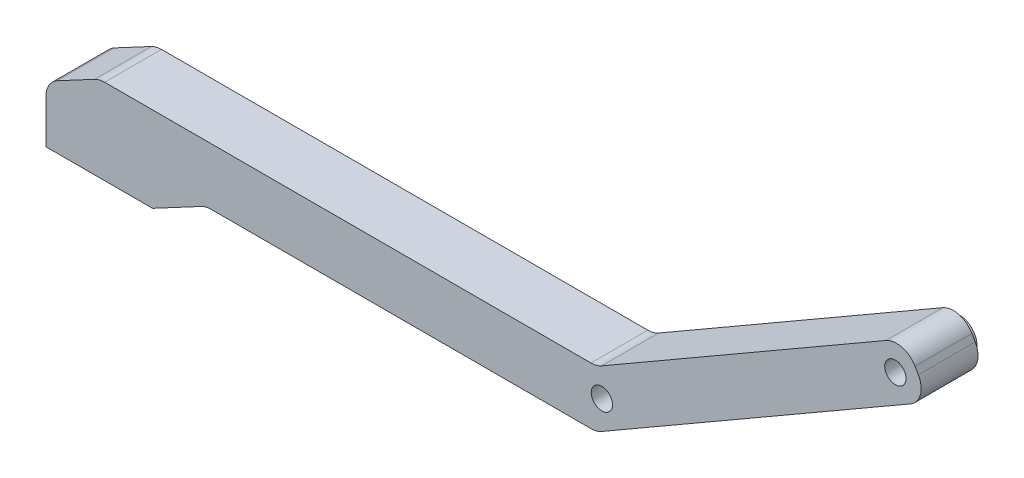
ISO-10303-21;
HEADER;
FILE_DESCRIPTION(('STEP AP214'),'2;1');
FILE_NAME('part.step','',(''),(''),'','','');
FILE_SCHEMA(('AUTOMOTIVE_DESIGN { 1 0 10303 214 1 1 1 1 }'));
ENDSEC;
DATA;
#1=APPLICATION_CONTEXT('core data for automotive mechanical design processes');
#2=APPLICATION_PROTOCOL_DEFINITION('international standard','automotive_design',2000,#1);
#3=PRODUCT_CONTEXT('',#1,'mechanical');
#4=PRODUCT('Part','Part','',(#3));
#5=PRODUCT_RELATED_PRODUCT_CATEGORY('part','',(#4));
#6=PRODUCT_DEFINITION_FORMATION('','',#4);
#7=PRODUCT_DEFINITION_CONTEXT('part definition',#1,'design');
#8=PRODUCT_DEFINITION('design','',#6,#7);
#9=PRODUCT_DEFINITION_SHAPE('','',#8);
#10=(LENGTH_UNIT() NAMED_UNIT(*) SI_UNIT(.MILLI.,.METRE.));
#11=(NAMED_UNIT(*) PLANE_ANGLE_UNIT() SI_UNIT($,.RADIAN.));
#12=(NAMED_UNIT(*) SI_UNIT($,.STERADIAN.) SOLID_ANGLE_UNIT());
#13=UNCERTAINTY_MEASURE_WITH_UNIT(LENGTH_MEASURE(1.E-05),#10,'distance_accuracy_value','');
#14=(GEOMETRIC_REPRESENTATION_CONTEXT(3) GLOBAL_UNCERTAINTY_ASSIGNED_CONTEXT((#13)) GLOBAL_UNIT_ASSIGNED_CONTEXT((#10,
#11,#12)) REPRESENTATION_CONTEXT('',''));
#15=CARTESIAN_POINT('',(0.,0.,0.));
#16=DIRECTION('',(0.,0.,1.));
#17=DIRECTION('',(1.,0.,0.));
#18=AXIS2_PLACEMENT_3D('',#15,#16,#17);
#19=CARTESIAN_POINT('',(0.,0.,8.));
#20=DIRECTION('',(0.,0.,1.));
#21=DIRECTION('',(1.,0.,0.));
#22=AXIS2_PLACEMENT_3D('',#19,#20,#21);
#23=PLANE('',#22);
#24=DIRECTION('',(-0.500000000000005,0.866025403784436,0.));
#25=VECTOR('',#24,1.);
#26=CARTESIAN_POINT('',(116.76537180436,27.,8.));
#27=LINE('',#26,#25);
#28=CARTESIAN_POINT('',(115.26537180436,29.5980762113533,8.));
#29=VERTEX_POINT('',#28);
#30=CARTESIAN_POINT('',(114.801270189222,30.4019237886467,8.));
#31=VERTEX_POINT('',#30);
#32=EDGE_CURVE('E335',#29,#31,#27,.T.);
#33=ORIENTED_EDGE('',*,*,#32,.T.);
#34=CARTESIAN_POINT('',(112.203193977869,28.9019237886467,8.));
#35=DIRECTION('',(0.,0.,1.));
#36=DIRECTION('',(1.,0.,0.));
#37=AXIS2_PLACEMENT_3D('',#34,#35,#36);
#38=CIRCLE('',#37,3.);
#39=CARTESIAN_POINT('',(110.703193977869,31.5,8.));
#40=VERTEX_POINT('',#39);
#41=EDGE_CURVE('E275',#31,#40,#38,.T.);
#42=ORIENTED_EDGE('',*,*,#41,.T.);
#43=DIRECTION('',(-0.866025403784439,-0.5,0.));
#44=VECTOR('',#43,1.);
#45=CARTESIAN_POINT('',(70.,8.,8.));
#46=LINE('',#45,#44);
#47=CARTESIAN_POINT('',(70.6961524227066,8.40192378864668,8.));
#48=VERTEX_POINT('',#47);
#49=EDGE_CURVE('E327',#40,#48,#46,.T.);
#50=ORIENTED_EDGE('',*,*,#49,.T.);
#51=CARTESIAN_POINT('',(69.1961524227066,11.,8.));
#52=DIRECTION('',(0.,0.,1.));
#53=DIRECTION('',(1.,0.,0.));
#54=AXIS2_PLACEMENT_3D('',#51,#52,#53);
#55=CIRCLE('',#54,3.);
#56=CARTESIAN_POINT('',(69.1961524227066,8.,8.));
#57=VERTEX_POINT('',#56);
#58=EDGE_CURVE('E11',#48,#57,#55,.F.);
#59=ORIENTED_EDGE('',*,*,#58,.T.);
#60=DIRECTION('',(-1.,0.,0.));
#61=VECTOR('',#60,1.);
#62=CARTESIAN_POINT('',(0.,8.,8.));
#63=LINE('',#62,#61);
#64=CARTESIAN_POINT('',(0.749999999999998,8.,8.));
#65=VERTEX_POINT('',#64);
#66=EDGE_CURVE('E325',#57,#65,#63,.T.);
#67=ORIENTED_EDGE('',*,*,#66,.T.);
#68=CARTESIAN_POINT('',(0.749999999999998,5.,8.));
#69=DIRECTION('',(0.,0.,1.));
#70=DIRECTION('',(1.,0.,0.));
#71=AXIS2_PLACEMENT_3D('',#68,#69,#70);
#72=CIRCLE('',#71,3.);
#73=CARTESIAN_POINT('',(-0.661764705882354,7.64705882352941,8.));
#74=VERTEX_POINT('',#73);
#75=EDGE_CURVE('E266',#65,#74,#72,.T.);
#76=ORIENTED_EDGE('',*,*,#75,.T.);
#77=DIRECTION('',(-0.882352941176471,-0.470588235294118,0.));
#78=VECTOR('',#77,1.);
#79=CARTESIAN_POINT('',(0.,8.,8.));
#80=LINE('',#79,#78);
#81=CARTESIAN_POINT('',(-5.91176470588236,4.84705882352941,8.));
#82=VERTEX_POINT('',#81);
#83=EDGE_CURVE('E170',#74,#82,#80,.T.);
#84=ORIENTED_EDGE('',*,*,#83,.T.);
#85=CARTESIAN_POINT('',(-4.5,2.2,8.));
#86=DIRECTION('',(0.,0.,1.));
#87=DIRECTION('',(1.,0.,0.));
#88=AXIS2_PLACEMENT_3D('',#85,#86,#87);
#89=CIRCLE('',#88,3.);
#90=CARTESIAN_POINT('',(-7.5,2.2,8.));
#91=VERTEX_POINT('',#90);
#92=EDGE_CURVE('E62',#82,#91,#89,.T.);
#93=ORIENTED_EDGE('',*,*,#92,.T.);
#94=DIRECTION('',(0.,-1.,0.));
#95=VECTOR('',#94,1.);
#96=CARTESIAN_POINT('',(-7.5,4.,8.));
#97=LINE('',#96,#95);
#98=CARTESIAN_POINT('',(-7.5,-4.,8.));
#99=VERTEX_POINT('',#98);
#100=EDGE_CURVE('E158',#91,#99,#97,.T.);
#101=ORIENTED_EDGE('',*,*,#100,.T.);
#102=DIRECTION('',(1.,0.,0.));
#103=VECTOR('',#102,1.);
#104=CARTESIAN_POINT('',(-7.5,-4.,8.));
#105=LINE('',#104,#103);
#106=CARTESIAN_POINT('',(7.5,-4.,8.));
#107=VERTEX_POINT('',#106);
#108=EDGE_CURVE('E164',#99,#107,#105,.T.);
#109=ORIENTED_EDGE('',*,*,#108,.T.);
#110=DIRECTION('',(0.882352941176471,0.470588235294118,0.));
#111=VECTOR('',#110,1.);
#112=CARTESIAN_POINT('',(7.5,-4.,8.));
#113=LINE('',#112,#111);
#114=CARTESIAN_POINT('',(14.3382352941176,-0.352941176470585,8.));
#115=VERTEX_POINT('',#114);
#116=EDGE_CURVE('E224',#107,#115,#113,.T.);
#117=ORIENTED_EDGE('',*,*,#116,.T.);
#118=CARTESIAN_POINT('',(15.75,-3.,8.));
#119=DIRECTION('',(0.,0.,1.));
#120=DIRECTION('',(1.,0.,0.));
#121=AXIS2_PLACEMENT_3D('',#118,#119,#120);
#122=CIRCLE('',#121,3.);
#123=CARTESIAN_POINT('',(15.75,0.,8.));
#124=VERTEX_POINT('',#123);
#125=EDGE_CURVE('E304',#115,#124,#122,.F.);
#126=ORIENTED_EDGE('',*,*,#125,.T.);
#127=DIRECTION('',(1.,0.,0.));
#128=VECTOR('',#127,1.);
#129=CARTESIAN_POINT('',(15.,0.,8.));
#130=LINE('',#129,#128);
#131=CARTESIAN_POINT('',(69.1961524227066,0.,8.));
#132=VERTEX_POINT('',#131);
#133=EDGE_CURVE('E344',#124,#132,#130,.T.);
#134=ORIENTED_EDGE('',*,*,#133,.T.);
#135=CARTESIAN_POINT('',(69.1961524227066,3.,8.));
#136=DIRECTION('',(0.,0.,1.));
#137=DIRECTION('',(1.,0.,0.));
#138=AXIS2_PLACEMENT_3D('',#135,#136,#137);
#139=CIRCLE('',#138,3.);
#140=CARTESIAN_POINT('',(70.6961524227066,0.40192378864668,8.));
#141=VERTEX_POINT('',#140);
#142=EDGE_CURVE('E269',#132,#141,#139,.T.);
#143=ORIENTED_EDGE('',*,*,#142,.T.);
#144=DIRECTION('',(0.866025403784439,0.5,0.));
#145=VECTOR('',#144,1.);
#146=CARTESIAN_POINT('',(70.,0.,8.));
#147=LINE('',#146,#145);
#148=CARTESIAN_POINT('',(114.167295593006,25.5,8.));
#149=VERTEX_POINT('',#148);
#150=EDGE_CURVE('E340',#141,#149,#147,.T.);
#151=ORIENTED_EDGE('',*,*,#150,.T.);
#152=CARTESIAN_POINT('',(112.667295593006,28.0980762113533,8.));
#153=DIRECTION('',(0.,0.,1.));
#154=DIRECTION('',(1.,0.,0.));
#155=AXIS2_PLACEMENT_3D('',#152,#153,#154);
#156=CIRCLE('',#155,3.);
#157=EDGE_CURVE('E272',#149,#29,#156,.T.);
#158=ORIENTED_EDGE('',*,*,#157,.T.);
#159=EDGE_LOOP('',(#33,#42,#50,#59,#67,#76,#84,#93,#101,#109,#117,#126,#134,#143,#151,#158));
#160=FACE_BOUND('',#159,.T.);
#161=CARTESIAN_POINT('',(70.727461339179,4.42000000000001,8.));
#162=DIRECTION('',(0.,0.,1.));
#163=DIRECTION('',(1.,0.,0.));
#164=AXIS2_PLACEMENT_3D('',#161,#162,#163);
#165=CIRCLE('',#164,1.5);
#166=CARTESIAN_POINT('',(72.227461339179,4.42000000000001,8.));
#167=VERTEX_POINT('',#166);
#168=EDGE_CURVE('E353',#167,#167,#165,.T.);
#169=ORIENTED_EDGE('',*,*,#168,.F.);
#170=EDGE_LOOP('',(#169));
#171=FACE_BOUND('',#170,.T.);
#172=CARTESIAN_POINT('',(112.036873099697,28.27,8.));
#173=DIRECTION('',(0.,0.,1.));
#174=DIRECTION('',(1.,0.,0.));
#175=AXIS2_PLACEMENT_3D('',#172,#173,#174);
#176=CIRCLE('',#175,1.5);
#177=CARTESIAN_POINT('',(113.536873099697,28.27,8.));
#178=VERTEX_POINT('',#177);
#179=EDGE_CURVE('E197',#178,#178,#176,.T.);
#180=ORIENTED_EDGE('',*,*,#179,.F.);
#181=EDGE_LOOP('',(#180));
#182=FACE_BOUND('',#181,.T.);
#183=ADVANCED_FACE('F45',(#160,#171,#182),#23,.T.);
#184=CARTESIAN_POINT('',(0.,0.,0.));
#185=DIRECTION('',(0.,0.,1.));
#186=DIRECTION('',(1.,0.,0.));
#187=AXIS2_PLACEMENT_3D('',#184,#185,#186);
#188=PLANE('',#187);
#189=CARTESIAN_POINT('',(112.036873099697,28.27,0.));
#190=DIRECTION('',(0.,0.,1.));
#191=DIRECTION('',(1.,0.,0.));
#192=AXIS2_PLACEMENT_3D('',#189,#190,#191);
#193=CIRCLE('',#192,2.5);
#194=CARTESIAN_POINT('',(114.536873099697,28.27,0.));
#195=VERTEX_POINT('',#194);
#196=EDGE_CURVE('E49',#195,#195,#193,.T.);
#197=ORIENTED_EDGE('',*,*,#196,.T.);
#198=EDGE_LOOP('',(#197));
#199=FACE_BOUND('',#198,.T.);
#200=DIRECTION('',(-0.866025403784439,-0.5,0.));
#201=VECTOR('',#200,1.);
#202=CARTESIAN_POINT('',(70.,8.,0.));
#203=LINE('',#202,#201);
#204=CARTESIAN_POINT('',(110.703193977869,31.5,0.));
#205=VERTEX_POINT('',#204);
#206=CARTESIAN_POINT('',(70.6961524227066,8.40192378864668,0.));
#207=VERTEX_POINT('',#206);
#208=EDGE_CURVE('E209',#205,#207,#203,.T.);
#209=ORIENTED_EDGE('',*,*,#208,.F.);
#210=CARTESIAN_POINT('',(112.203193977869,28.9019237886467,0.));
#211=DIRECTION('',(0.,0.,1.));
#212=DIRECTION('',(1.,0.,0.));
#213=AXIS2_PLACEMENT_3D('',#210,#211,#212);
#214=CIRCLE('',#213,3.);
#215=CARTESIAN_POINT('',(114.801270189222,30.4019237886467,0.));
#216=VERTEX_POINT('',#215);
#217=EDGE_CURVE('E254',#205,#216,#214,.F.);
#218=ORIENTED_EDGE('',*,*,#217,.T.);
#219=DIRECTION('',(-0.500000000000005,0.866025403784436,0.));
#220=VECTOR('',#219,1.);
#221=CARTESIAN_POINT('',(116.76537180436,27.,0.));
#222=LINE('',#221,#220);
#223=CARTESIAN_POINT('',(115.26537180436,29.5980762113533,0.));
#224=VERTEX_POINT('',#223);
#225=EDGE_CURVE('E205',#224,#216,#222,.T.);
#226=ORIENTED_EDGE('',*,*,#225,.F.);
#227=CARTESIAN_POINT('',(112.667295593006,28.0980762113533,0.));
#228=DIRECTION('',(0.,0.,1.));
#229=DIRECTION('',(1.,0.,0.));
#230=AXIS2_PLACEMENT_3D('',#227,#228,#229);
#231=CIRCLE('',#230,3.);
#232=CARTESIAN_POINT('',(114.167295593006,25.5,0.));
#233=VERTEX_POINT('',#232);
#234=EDGE_CURVE('E251',#224,#233,#231,.F.);
#235=ORIENTED_EDGE('',*,*,#234,.T.);
#236=DIRECTION('',(0.866025403784439,0.5,0.));
#237=VECTOR('',#236,1.);
#238=CARTESIAN_POINT('',(70.,0.,0.));
#239=LINE('',#238,#237);
#240=CARTESIAN_POINT('',(70.6961524227066,0.40192378864668,0.));
#241=VERTEX_POINT('',#240);
#242=EDGE_CURVE('E201',#241,#233,#239,.T.);
#243=ORIENTED_EDGE('',*,*,#242,.F.);
#244=CARTESIAN_POINT('',(69.1961524227066,3.,0.));
#245=DIRECTION('',(0.,0.,1.));
#246=DIRECTION('',(1.,0.,0.));
#247=AXIS2_PLACEMENT_3D('',#244,#245,#246);
#248=CIRCLE('',#247,3.);
#249=CARTESIAN_POINT('',(69.1961524227066,0.,0.));
#250=VERTEX_POINT('',#249);
#251=EDGE_CURVE('E248',#241,#250,#248,.F.);
#252=ORIENTED_EDGE('',*,*,#251,.T.);
#253=DIRECTION('',(1.,0.,0.));
#254=VECTOR('',#253,1.);
#255=CARTESIAN_POINT('',(15.,0.,0.));
#256=LINE('',#255,#254);
#257=CARTESIAN_POINT('',(15.75,0.,0.));
#258=VERTEX_POINT('',#257);
#259=EDGE_CURVE('E196',#258,#250,#256,.T.);
#260=ORIENTED_EDGE('',*,*,#259,.F.);
#261=CARTESIAN_POINT('',(15.75,-3.,0.));
#262=DIRECTION('',(0.,0.,1.));
#263=DIRECTION('',(1.,0.,0.));
#264=AXIS2_PLACEMENT_3D('',#261,#262,#263);
#265=CIRCLE('',#264,3.);
#266=CARTESIAN_POINT('',(14.3382352941176,-0.352941176470585,0.));
#267=VERTEX_POINT('',#266);
#268=EDGE_CURVE('E301',#258,#267,#265,.T.);
#269=ORIENTED_EDGE('',*,*,#268,.T.);
#270=DIRECTION('',(0.882352941176471,0.470588235294118,0.));
#271=VECTOR('',#270,1.);
#272=CARTESIAN_POINT('',(7.5,-4.,0.));
#273=LINE('',#272,#271);
#274=CARTESIAN_POINT('',(7.5,-4.,0.));
#275=VERTEX_POINT('',#274);
#276=EDGE_CURVE('E192',#275,#267,#273,.T.);
#277=ORIENTED_EDGE('',*,*,#276,.F.);
#278=DIRECTION('',(1.,0.,0.));
#279=VECTOR('',#278,1.);
#280=CARTESIAN_POINT('',(-7.5,-4.,0.));
#281=LINE('',#280,#279);
#282=CARTESIAN_POINT('',(-7.5,-4.,0.));
#283=VERTEX_POINT('',#282);
#284=EDGE_CURVE('E222',#283,#275,#281,.T.);
#285=ORIENTED_EDGE('',*,*,#284,.F.);
#286=DIRECTION('',(0.,-1.,0.));
#287=VECTOR('',#286,1.);
#288=CARTESIAN_POINT('',(-7.5,4.,0.));
#289=LINE('',#288,#287);
#290=CARTESIAN_POINT('',(-7.5,2.2,0.));
#291=VERTEX_POINT('',#290);
#292=EDGE_CURVE('E176',#291,#283,#289,.T.);
#293=ORIENTED_EDGE('',*,*,#292,.F.);
#294=CARTESIAN_POINT('',(-4.5,2.2,0.));
#295=DIRECTION('',(0.,0.,1.));
#296=DIRECTION('',(1.,0.,0.));
#297=AXIS2_PLACEMENT_3D('',#294,#295,#296);
#298=CIRCLE('',#297,3.);
#299=CARTESIAN_POINT('',(-5.91176470588236,4.84705882352941,0.));
#300=VERTEX_POINT('',#299);
#301=EDGE_CURVE('E242',#291,#300,#298,.F.);
#302=ORIENTED_EDGE('',*,*,#301,.T.);
#303=DIRECTION('',(-0.882352941176471,-0.470588235294118,0.));
#304=VECTOR('',#303,1.);
#305=CARTESIAN_POINT('',(0.,8.,0.));
#306=LINE('',#305,#304);
#307=CARTESIAN_POINT('',(-0.661764705882354,7.64705882352941,0.));
#308=VERTEX_POINT('',#307);
#309=EDGE_CURVE('E217',#308,#300,#306,.T.);
#310=ORIENTED_EDGE('',*,*,#309,.F.);
#311=CARTESIAN_POINT('',(0.749999999999998,5.,0.));
#312=DIRECTION('',(0.,0.,1.));
#313=DIRECTION('',(1.,0.,0.));
#314=AXIS2_PLACEMENT_3D('',#311,#312,#313);
#315=CIRCLE('',#314,3.);
#316=CARTESIAN_POINT('',(0.749999999999998,8.,0.));
#317=VERTEX_POINT('',#316);
#318=EDGE_CURVE('E245',#308,#317,#315,.F.);
#319=ORIENTED_EDGE('',*,*,#318,.T.);
#320=DIRECTION('',(-1.,0.,0.));
#321=VECTOR('',#320,1.);
#322=CARTESIAN_POINT('',(0.,8.,0.));
#323=LINE('',#322,#321);
#324=CARTESIAN_POINT('',(69.1961524227066,8.,0.));
#325=VERTEX_POINT('',#324);
#326=EDGE_CURVE('E213',#325,#317,#323,.T.);
#327=ORIENTED_EDGE('',*,*,#326,.F.);
#328=CARTESIAN_POINT('',(69.1961524227066,11.,0.));
#329=DIRECTION('',(0.,0.,1.));
#330=DIRECTION('',(1.,0.,0.));
#331=AXIS2_PLACEMENT_3D('',#328,#329,#330);
#332=CIRCLE('',#331,3.);
#333=EDGE_CURVE('E55',#325,#207,#332,.T.);
#334=ORIENTED_EDGE('',*,*,#333,.T.);
#335=EDGE_LOOP('',(#209,#218,#226,#235,#243,#252,#260,#269,#277,#285,#293,#302,#310,#319,#327,#334));
#336=FACE_BOUND('',#335,.T.);
#337=CARTESIAN_POINT('',(70.727461339179,4.42000000000001,0.));
#338=DIRECTION('',(0.,0.,1.));
#339=DIRECTION('',(1.,0.,0.));
#340=AXIS2_PLACEMENT_3D('',#337,#338,#339);
#341=CIRCLE('',#340,1.5);
#342=CARTESIAN_POINT('',(72.227461339179,4.42000000000001,0.));
#343=VERTEX_POINT('',#342);
#344=EDGE_CURVE('E354',#343,#343,#341,.T.);
#345=ORIENTED_EDGE('',*,*,#344,.T.);
#346=EDGE_LOOP('',(#345));
#347=FACE_BOUND('',#346,.T.);
#348=ADVANCED_FACE('F311',(#199,#336,#347),#188,.F.);
#349=CARTESIAN_POINT('',(7.5,-4.,8.));
#350=DIRECTION('',(-0.470588235294118,0.88235294117647,0.));
#351=DIRECTION('',(-0.882352941176471,-0.470588235294118,0.));
#352=AXIS2_PLACEMENT_3D('',#349,#350,#351);
#353=PLANE('',#352);
#354=ORIENTED_EDGE('',*,*,#276,.T.);
#355=DIRECTION('',(0.,0.,-1.));
#356=VECTOR('',#355,1.);
#357=CARTESIAN_POINT('',(14.3382352941176,-0.352941176470586,8.));
#358=LINE('',#357,#356);
#359=EDGE_CURVE('E232',#267,#115,#358,.F.);
#360=ORIENTED_EDGE('',*,*,#359,.T.);
#361=ORIENTED_EDGE('',*,*,#116,.F.);
#362=DIRECTION('',(0.,0.,-1.));
#363=VECTOR('',#362,1.);
#364=CARTESIAN_POINT('',(7.5,-4.,8.));
#365=LINE('',#364,#363);
#366=EDGE_CURVE('E181',#107,#275,#365,.T.);
#367=ORIENTED_EDGE('',*,*,#366,.T.);
#368=EDGE_LOOP('',(#354,#360,#361,#367));
#369=FACE_BOUND('',#368,.T.);
#370=ADVANCED_FACE('F393',(#369),#353,.F.);
#371=CARTESIAN_POINT('',(15.,0.,8.));
#372=DIRECTION('',(0.,1.,0.));
#373=DIRECTION('',(-1.,0.,0.));
#374=AXIS2_PLACEMENT_3D('',#371,#372,#373);
#375=PLANE('',#374);
#376=ORIENTED_EDGE('',*,*,#133,.F.);
#377=DIRECTION('',(0.,0.,-1.));
#378=VECTOR('',#377,1.);
#379=CARTESIAN_POINT('',(15.75,0.,0.));
#380=LINE('',#379,#378);
#381=EDGE_CURVE('E228',#124,#258,#380,.T.);
#382=ORIENTED_EDGE('',*,*,#381,.T.);
#383=ORIENTED_EDGE('',*,*,#259,.T.);
#384=DIRECTION('',(0.,0.,-1.));
#385=VECTOR('',#384,1.);
#386=CARTESIAN_POINT('',(69.1961524227066,0.,8.));
#387=LINE('',#386,#385);
#388=EDGE_CURVE('E180',#250,#132,#387,.F.);
#389=ORIENTED_EDGE('',*,*,#388,.T.);
#390=EDGE_LOOP('',(#376,#382,#383,#389));
#391=FACE_BOUND('',#390,.T.);
#392=ADVANCED_FACE('F413',(#391),#375,.F.);
#393=CARTESIAN_POINT('',(70.,0.,8.));
#394=DIRECTION('',(-0.5,0.866025403784439,0.));
#395=DIRECTION('',(-0.866025403784439,-0.5,0.));
#396=AXIS2_PLACEMENT_3D('',#393,#394,#395);
#397=PLANE('',#396);
#398=ORIENTED_EDGE('',*,*,#242,.T.);
#399=DIRECTION('',(0.,0.,-1.));
#400=VECTOR('',#399,1.);
#401=CARTESIAN_POINT('',(114.167295593006,25.5,8.));
#402=LINE('',#401,#400);
#403=EDGE_CURVE('E282',#233,#149,#402,.F.);
#404=ORIENTED_EDGE('',*,*,#403,.T.);
#405=ORIENTED_EDGE('',*,*,#150,.F.);
#406=DIRECTION('',(0.,0.,-1.));
#407=VECTOR('',#406,1.);
#408=CARTESIAN_POINT('',(70.6961524227066,0.401923788646679,8.));
#409=LINE('',#408,#407);
#410=EDGE_CURVE('E278',#141,#241,#409,.T.);
#411=ORIENTED_EDGE('',*,*,#410,.T.);
#412=EDGE_LOOP('',(#398,#404,#405,#411));
#413=FACE_BOUND('',#412,.T.);
#414=ADVANCED_FACE('F409',(#413),#397,.F.);
#415=CARTESIAN_POINT('',(116.76537180436,27.,8.));
#416=DIRECTION('',(-0.866025403784436,-0.500000000000004,0.));
#417=DIRECTION('',(0.500000000000005,-0.866025403784436,0.));
#418=AXIS2_PLACEMENT_3D('',#415,#416,#417);
#419=PLANE('',#418);
#420=ORIENTED_EDGE('',*,*,#225,.T.);
#421=DIRECTION('',(0.,0.,-1.));
#422=VECTOR('',#421,1.);
#423=CARTESIAN_POINT('',(114.801270189222,30.4019237886467,8.));
#424=LINE('',#423,#422);
#425=EDGE_CURVE('E261',#216,#31,#424,.F.);
#426=ORIENTED_EDGE('',*,*,#425,.T.);
#427=ORIENTED_EDGE('',*,*,#32,.F.);
#428=DIRECTION('',(0.,0.,-1.));
#429=VECTOR('',#428,1.);
#430=CARTESIAN_POINT('',(115.26537180436,29.5980762113533,8.));
#431=LINE('',#430,#429);
#432=EDGE_CURVE('E257',#29,#224,#431,.T.);
#433=ORIENTED_EDGE('',*,*,#432,.T.);
#434=EDGE_LOOP('',(#420,#426,#427,#433));
#435=FACE_BOUND('',#434,.T.);
#436=ADVANCED_FACE('F406',(#435),#419,.F.);
#437=CARTESIAN_POINT('',(70.,8.,8.));
#438=DIRECTION('',(0.5,-0.866025403784439,0.));
#439=DIRECTION('',(0.866025403784439,0.5,0.));
#440=AXIS2_PLACEMENT_3D('',#437,#438,#439);
#441=PLANE('',#440);
#442=ORIENTED_EDGE('',*,*,#49,.F.);
#443=DIRECTION('',(0.,0.,-1.));
#444=VECTOR('',#443,1.);
#445=CARTESIAN_POINT('',(110.703193977869,31.5,8.));
#446=LINE('',#445,#444);
#447=EDGE_CURVE('E238',#40,#205,#446,.T.);
#448=ORIENTED_EDGE('',*,*,#447,.T.);
#449=ORIENTED_EDGE('',*,*,#208,.T.);
#450=DIRECTION('',(0.,0.,-1.));
#451=VECTOR('',#450,1.);
#452=CARTESIAN_POINT('',(70.6961524227066,8.40192378864668,8.));
#453=LINE('',#452,#451);
#454=EDGE_CURVE('E235',#207,#48,#453,.F.);
#455=ORIENTED_EDGE('',*,*,#454,.T.);
#456=EDGE_LOOP('',(#442,#448,#449,#455));
#457=FACE_BOUND('',#456,.T.);
#458=ADVANCED_FACE('F318',(#457),#441,.F.);
#459=CARTESIAN_POINT('',(0.,8.,8.));
#460=DIRECTION('',(0.,-1.,0.));
#461=DIRECTION('',(0.,0.,-1.));
#462=AXIS2_PLACEMENT_3D('',#459,#460,#461);
#463=PLANE('',#462);
#464=ORIENTED_EDGE('',*,*,#66,.F.);
#465=DIRECTION('',(0.,0.,-1.));
#466=VECTOR('',#465,1.);
#467=CARTESIAN_POINT('',(69.1961524227066,8.,0.));
#468=LINE('',#467,#466);
#469=EDGE_CURVE('E288',#57,#325,#468,.T.);
#470=ORIENTED_EDGE('',*,*,#469,.T.);
#471=ORIENTED_EDGE('',*,*,#326,.T.);
#472=DIRECTION('',(0.,0.,-1.));
#473=VECTOR('',#472,1.);
#474=CARTESIAN_POINT('',(0.749999999999998,8.,8.));
#475=LINE('',#474,#473);
#476=EDGE_CURVE('E285',#317,#65,#475,.F.);
#477=ORIENTED_EDGE('',*,*,#476,.T.);
#478=EDGE_LOOP('',(#464,#470,#471,#477));
#479=FACE_BOUND('',#478,.T.);
#480=ADVANCED_FACE('F329',(#479),#463,.F.);
#481=CARTESIAN_POINT('',(0.,8.,8.));
#482=DIRECTION('',(0.470588235294118,-0.882352941176471,0.));
#483=DIRECTION('',(0.882352941176471,0.470588235294118,0.));
#484=AXIS2_PLACEMENT_3D('',#481,#482,#483);
#485=PLANE('',#484);
#486=ORIENTED_EDGE('',*,*,#83,.F.);
#487=DIRECTION('',(0.,0.,-1.));
#488=VECTOR('',#487,1.);
#489=CARTESIAN_POINT('',(-0.661764705882354,7.64705882352941,8.));
#490=LINE('',#489,#488);
#491=EDGE_CURVE('E294',#74,#308,#490,.T.);
#492=ORIENTED_EDGE('',*,*,#491,.T.);
#493=ORIENTED_EDGE('',*,*,#309,.T.);
#494=DIRECTION('',(0.,0.,-1.));
#495=VECTOR('',#494,1.);
#496=CARTESIAN_POINT('',(-5.91176470588236,4.84705882352941,8.));
#497=LINE('',#496,#495);
#498=EDGE_CURVE('E70',#300,#82,#497,.F.);
#499=ORIENTED_EDGE('',*,*,#498,.T.);
#500=EDGE_LOOP('',(#486,#492,#493,#499));
#501=FACE_BOUND('',#500,.T.);
#502=ADVANCED_FACE('F399',(#501),#485,.F.);
#503=CARTESIAN_POINT('',(-7.5,4.,8.));
#504=DIRECTION('',(1.,0.,0.));
#505=DIRECTION('',(0.,0.,-1.));
#506=AXIS2_PLACEMENT_3D('',#503,#504,#505);
#507=PLANE('',#506);
#508=ORIENTED_EDGE('',*,*,#100,.F.);
#509=DIRECTION('',(0.,0.,-1.));
#510=VECTOR('',#509,1.);
#511=CARTESIAN_POINT('',(-7.5,2.2,8.));
#512=LINE('',#511,#510);
#513=EDGE_CURVE('E298',#91,#291,#512,.T.);
#514=ORIENTED_EDGE('',*,*,#513,.T.);
#515=ORIENTED_EDGE('',*,*,#292,.T.);
#516=DIRECTION('',(0.,0.,-1.));
#517=VECTOR('',#516,1.);
#518=CARTESIAN_POINT('',(-7.5,-4.,8.));
#519=LINE('',#518,#517);
#520=EDGE_CURVE('E173',#99,#283,#519,.T.);
#521=ORIENTED_EDGE('',*,*,#520,.F.);
#522=EDGE_LOOP('',(#508,#514,#515,#521));
#523=FACE_BOUND('',#522,.T.);
#524=ADVANCED_FACE('F174',(#523),#507,.F.);
#525=CARTESIAN_POINT('',(-7.5,-4.,8.));
#526=DIRECTION('',(0.,1.,0.));
#527=DIRECTION('',(0.,0.,1.));
#528=AXIS2_PLACEMENT_3D('',#525,#526,#527);
#529=PLANE('',#528);
#530=ORIENTED_EDGE('',*,*,#284,.T.);
#531=ORIENTED_EDGE('',*,*,#366,.F.);
#532=ORIENTED_EDGE('',*,*,#108,.F.);
#533=ORIENTED_EDGE('',*,*,#520,.T.);
#534=EDGE_LOOP('',(#530,#531,#532,#533));
#535=FACE_BOUND('',#534,.T.);
#536=ADVANCED_FACE('F183',(#535),#529,.F.);
#537=CARTESIAN_POINT('',(112.036873099697,28.27,8.));
#538=DIRECTION('',(0.,0.,-1.));
#539=DIRECTION('',(-1.,0.,0.));
#540=AXIS2_PLACEMENT_3D('',#537,#538,#539);
#541=CYLINDRICAL_SURFACE('',#540,1.5);
#542=ORIENTED_EDGE('',*,*,#179,.T.);
#543=EDGE_LOOP('',(#542));
#544=FACE_BOUND('',#543,.T.);
#545=CARTESIAN_POINT('',(112.036873099697,28.27,-0.999999999999999));
#546=DIRECTION('',(0.,0.,1.));
#547=DIRECTION('',(1.,0.,0.));
#548=AXIS2_PLACEMENT_3D('',#545,#546,#547);
#549=CIRCLE('',#548,1.5);
#550=CARTESIAN_POINT('',(113.536873099697,28.27,-0.999999999999999));
#551=VERTEX_POINT('',#550);
#552=EDGE_CURVE('E365',#551,#551,#549,.T.);
#553=ORIENTED_EDGE('',*,*,#552,.F.);
#554=EDGE_LOOP('',(#553));
#555=FACE_BOUND('',#554,.T.);
#556=ADVANCED_FACE('F373',(#544,#555),#541,.F.);
#557=CARTESIAN_POINT('',(70.727461339179,4.42000000000001,8.));
#558=DIRECTION('',(0.,0.,-1.));
#559=DIRECTION('',(-1.,0.,0.));
#560=AXIS2_PLACEMENT_3D('',#557,#558,#559);
#561=CYLINDRICAL_SURFACE('',#560,1.5);
#562=ORIENTED_EDGE('',*,*,#168,.T.);
#563=EDGE_LOOP('',(#562));
#564=FACE_BOUND('',#563,.T.);
#565=ORIENTED_EDGE('',*,*,#344,.F.);
#566=EDGE_LOOP('',(#565));
#567=FACE_BOUND('',#566,.T.);
#568=ADVANCED_FACE('F375',(#564,#567),#561,.F.);
#569=CARTESIAN_POINT('',(15.75,-3.,8.));
#570=DIRECTION('',(0.,0.,1.));
#571=DIRECTION('',(1.,0.,0.));
#572=AXIS2_PLACEMENT_3D('',#569,#570,#571);
#573=CYLINDRICAL_SURFACE('',#572,3.);
#574=ORIENTED_EDGE('',*,*,#125,.F.);
#575=ORIENTED_EDGE('',*,*,#359,.F.);
#576=ORIENTED_EDGE('',*,*,#268,.F.);
#577=ORIENTED_EDGE('',*,*,#381,.F.);
#578=EDGE_LOOP('',(#574,#575,#576,#577));
#579=FACE_BOUND('',#578,.T.);
#580=ADVANCED_FACE('F383',(#579),#573,.F.);
#581=CARTESIAN_POINT('',(112.203193977869,28.9019237886467,8.));
#582=DIRECTION('',(0.,0.,-1.));
#583=DIRECTION('',(-1.,0.,0.));
#584=AXIS2_PLACEMENT_3D('',#581,#582,#583);
#585=CYLINDRICAL_SURFACE('',#584,3.);
#586=ORIENTED_EDGE('',*,*,#41,.F.);
#587=ORIENTED_EDGE('',*,*,#425,.F.);
#588=ORIENTED_EDGE('',*,*,#217,.F.);
#589=ORIENTED_EDGE('',*,*,#447,.F.);
#590=EDGE_LOOP('',(#586,#587,#588,#589));
#591=FACE_BOUND('',#590,.T.);
#592=ADVANCED_FACE('F423',(#591),#585,.T.);
#593=CARTESIAN_POINT('',(112.667295593006,28.0980762113533,8.));
#594=DIRECTION('',(0.,0.,-1.));
#595=DIRECTION('',(-1.,0.,0.));
#596=AXIS2_PLACEMENT_3D('',#593,#594,#595);
#597=CYLINDRICAL_SURFACE('',#596,3.);
#598=ORIENTED_EDGE('',*,*,#157,.F.);
#599=ORIENTED_EDGE('',*,*,#403,.F.);
#600=ORIENTED_EDGE('',*,*,#234,.F.);
#601=ORIENTED_EDGE('',*,*,#432,.F.);
#602=EDGE_LOOP('',(#598,#599,#600,#601));
#603=FACE_BOUND('',#602,.T.);
#604=ADVANCED_FACE('F427',(#603),#597,.T.);
#605=CARTESIAN_POINT('',(69.1961524227066,3.,8.));
#606=DIRECTION('',(0.,0.,-1.));
#607=DIRECTION('',(-1.,0.,0.));
#608=AXIS2_PLACEMENT_3D('',#605,#606,#607);
#609=CYLINDRICAL_SURFACE('',#608,3.);
#610=ORIENTED_EDGE('',*,*,#142,.F.);
#611=ORIENTED_EDGE('',*,*,#388,.F.);
#612=ORIENTED_EDGE('',*,*,#251,.F.);
#613=ORIENTED_EDGE('',*,*,#410,.F.);
#614=EDGE_LOOP('',(#610,#611,#612,#613));
#615=FACE_BOUND('',#614,.T.);
#616=ADVANCED_FACE('F431',(#615),#609,.T.);
#617=CARTESIAN_POINT('',(69.1961524227066,11.,8.));
#618=DIRECTION('',(0.,0.,1.));
#619=DIRECTION('',(1.,0.,0.));
#620=AXIS2_PLACEMENT_3D('',#617,#618,#619);
#621=CYLINDRICAL_SURFACE('',#620,3.);
#622=ORIENTED_EDGE('',*,*,#58,.F.);
#623=ORIENTED_EDGE('',*,*,#454,.F.);
#624=ORIENTED_EDGE('',*,*,#333,.F.);
#625=ORIENTED_EDGE('',*,*,#469,.F.);
#626=EDGE_LOOP('',(#622,#623,#624,#625));
#627=FACE_BOUND('',#626,.T.);
#628=ADVANCED_FACE('F322',(#627),#621,.F.);
#629=CARTESIAN_POINT('',(0.749999999999998,5.,8.));
#630=DIRECTION('',(0.,0.,-1.));
#631=DIRECTION('',(-1.,0.,0.));
#632=AXIS2_PLACEMENT_3D('',#629,#630,#631);
#633=CYLINDRICAL_SURFACE('',#632,3.);
#634=ORIENTED_EDGE('',*,*,#75,.F.);
#635=ORIENTED_EDGE('',*,*,#476,.F.);
#636=ORIENTED_EDGE('',*,*,#318,.F.);
#637=ORIENTED_EDGE('',*,*,#491,.F.);
#638=EDGE_LOOP('',(#634,#635,#636,#637));
#639=FACE_BOUND('',#638,.T.);
#640=ADVANCED_FACE('F437',(#639),#633,.T.);
#641=CARTESIAN_POINT('',(-4.5,2.2,8.));
#642=DIRECTION('',(0.,0.,-1.));
#643=DIRECTION('',(-1.,0.,0.));
#644=AXIS2_PLACEMENT_3D('',#641,#642,#643);
#645=CYLINDRICAL_SURFACE('',#644,3.);
#646=ORIENTED_EDGE('',*,*,#92,.F.);
#647=ORIENTED_EDGE('',*,*,#498,.F.);
#648=ORIENTED_EDGE('',*,*,#301,.F.);
#649=ORIENTED_EDGE('',*,*,#513,.F.);
#650=EDGE_LOOP('',(#646,#647,#648,#649));
#651=FACE_BOUND('',#650,.T.);
#652=ADVANCED_FACE('F47',(#651),#645,.T.);
#653=CARTESIAN_POINT('',(112.036873099697,28.27,-0.999999999999999));
#654=DIRECTION('',(0.,0.,1.));
#655=DIRECTION('',(1.,0.,0.));
#656=AXIS2_PLACEMENT_3D('',#653,#654,#655);
#657=CYLINDRICAL_SURFACE('',#656,2.5);
#658=CARTESIAN_POINT('',(112.036873099697,28.27,-0.999999999999999));
#659=DIRECTION('',(0.,0.,1.));
#660=DIRECTION('',(1.,0.,0.));
#661=AXIS2_PLACEMENT_3D('',#658,#659,#660);
#662=CIRCLE('',#661,2.5);
#663=CARTESIAN_POINT('',(114.536873099697,28.27,-0.999999999999999));
#664=VERTEX_POINT('',#663);
#665=EDGE_CURVE('E361',#664,#664,#662,.T.);
#666=ORIENTED_EDGE('',*,*,#665,.T.);
#667=EDGE_LOOP('',(#666));
#668=FACE_BOUND('',#667,.T.);
#669=ORIENTED_EDGE('',*,*,#196,.F.);
#670=EDGE_LOOP('',(#669));
#671=FACE_BOUND('',#670,.T.);
#672=ADVANCED_FACE('F442',(#668,#671),#657,.T.);
#673=CARTESIAN_POINT('',(112.036873099697,28.27,-0.999999999999999));
#674=DIRECTION('',(0.,0.,1.));
#675=DIRECTION('',(1.,0.,0.));
#676=AXIS2_PLACEMENT_3D('',#673,#674,#675);
#677=PLANE('',#676);
#678=ORIENTED_EDGE('',*,*,#552,.T.);
#679=EDGE_LOOP('',(#678));
#680=FACE_BOUND('',#679,.T.);
#681=ORIENTED_EDGE('',*,*,#665,.F.);
#682=EDGE_LOOP('',(#681));
#683=FACE_BOUND('',#682,.T.);
#684=ADVANCED_FACE('F370',(#680,#683),#677,.F.);
#685=CLOSED_SHELL('',(#183,#348,#370,#392,#414,#436,#458,#480,#502,#524,#536,#556,#568,#580,
#592,#604,#616,#628,#640,#652,#672,#684));
#686=MANIFOLD_SOLID_BREP('B2',#685);
#687=ADVANCED_BREP_SHAPE_REPRESENTATION('',(#18,#686),#14);
#688=SHAPE_DEFINITION_REPRESENTATION(#9,#687);
ENDSEC;
END-ISO-10303-21;
